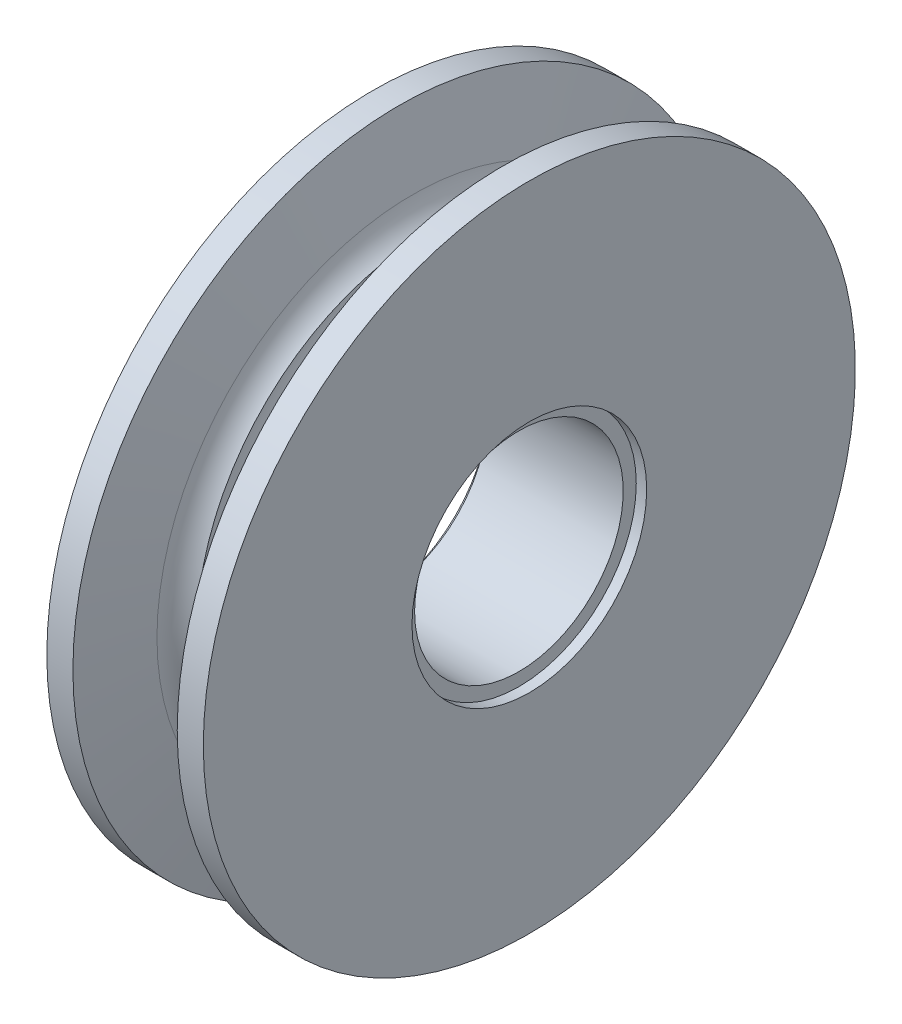
ISO-10303-21;
HEADER;
FILE_DESCRIPTION(('STEP AP214'),'2;1');
FILE_NAME('part.step','',(''),(''),'','','');
FILE_SCHEMA(('AUTOMOTIVE_DESIGN { 1 0 10303 214 1 1 1 1 }'));
ENDSEC;
DATA;
#1=APPLICATION_CONTEXT('core data for automotive mechanical design processes');
#2=APPLICATION_PROTOCOL_DEFINITION('international standard','automotive_design',2000,#1);
#3=PRODUCT_CONTEXT('',#1,'mechanical');
#4=PRODUCT('Part','Part','',(#3));
#5=PRODUCT_RELATED_PRODUCT_CATEGORY('part','',(#4));
#6=PRODUCT_DEFINITION_FORMATION('','',#4);
#7=PRODUCT_DEFINITION_CONTEXT('part definition',#1,'design');
#8=PRODUCT_DEFINITION('design','',#6,#7);
#9=PRODUCT_DEFINITION_SHAPE('','',#8);
#10=(LENGTH_UNIT() NAMED_UNIT(*) SI_UNIT(.MILLI.,.METRE.));
#11=(NAMED_UNIT(*) PLANE_ANGLE_UNIT() SI_UNIT($,.RADIAN.));
#12=(NAMED_UNIT(*) SI_UNIT($,.STERADIAN.) SOLID_ANGLE_UNIT());
#13=UNCERTAINTY_MEASURE_WITH_UNIT(LENGTH_MEASURE(1.E-05),#10,'distance_accuracy_value','');
#14=(GEOMETRIC_REPRESENTATION_CONTEXT(3) GLOBAL_UNCERTAINTY_ASSIGNED_CONTEXT((#13)) GLOBAL_UNIT_ASSIGNED_CONTEXT((#10,
#11,#12)) REPRESENTATION_CONTEXT('',''));
#15=CARTESIAN_POINT('',(0.,0.,0.));
#16=DIRECTION('',(0.,0.,1.));
#17=DIRECTION('',(1.,0.,0.));
#18=AXIS2_PLACEMENT_3D('',#15,#16,#17);
#19=CARTESIAN_POINT('',(6.,0.,0.));
#20=DIRECTION('',(-1.,0.,0.));
#21=DIRECTION('',(0.,0.,1.));
#22=AXIS2_PLACEMENT_3D('',#19,#20,#21);
#23=CYLINDRICAL_SURFACE('',#22,8.);
#24=CARTESIAN_POINT('',(-5.2,0.,0.));
#25=DIRECTION('',(-1.,0.,0.));
#26=DIRECTION('',(0.,0.,1.));
#27=AXIS2_PLACEMENT_3D('',#24,#25,#26);
#28=CIRCLE('',#27,8.);
#29=CARTESIAN_POINT('',(-5.2,0.,8.));
#30=VERTEX_POINT('',#29);
#31=EDGE_CURVE('E49',#30,#30,#28,.F.);
#32=CARTESIAN_POINT('',(5.2,0.,0.));
#33=DIRECTION('',(1.,0.,0.));
#34=DIRECTION('',(0.,0.,-1.));
#35=AXIS2_PLACEMENT_3D('',#32,#33,#34);
#36=CIRCLE('',#35,8.);
#37=CARTESIAN_POINT('',(5.2,0.,8.));
#38=VERTEX_POINT('',#37);
#39=EDGE_CURVE('E37',#38,#38,#36,.F.);
#40=CARTESIAN_POINT('',(-5.2,0.,8.));
#41=CARTESIAN_POINT('',(-5.09166666666666,0.,8.));
#42=CARTESIAN_POINT('',(-4.98333333333333,0.,8.));
#43=CARTESIAN_POINT('',(-4.76666666666666,0.,8.));
#44=CARTESIAN_POINT('',(-4.65833333333333,0.,8.));
#45=CARTESIAN_POINT('',(-4.44166666666666,0.,8.));
#46=CARTESIAN_POINT('',(-4.33333333333333,0.,8.));
#47=CARTESIAN_POINT('',(-4.11666666666667,0.,8.));
#48=CARTESIAN_POINT('',(-4.00833333333333,0.,8.));
#49=CARTESIAN_POINT('',(-3.79166666666667,0.,8.));
#50=CARTESIAN_POINT('',(-3.68333333333333,0.,8.));
#51=CARTESIAN_POINT('',(-3.46666666666666,0.,8.));
#52=CARTESIAN_POINT('',(-3.35833333333333,0.,8.));
#53=CARTESIAN_POINT('',(-3.14166666666666,0.,8.));
#54=CARTESIAN_POINT('',(-3.03333333333333,0.,8.));
#55=CARTESIAN_POINT('',(-2.81666666666667,0.,8.));
#56=CARTESIAN_POINT('',(-2.70833333333333,0.,8.));
#57=CARTESIAN_POINT('',(-2.49166666666666,0.,8.));
#58=CARTESIAN_POINT('',(-2.38333333333333,0.,8.));
#59=CARTESIAN_POINT('',(-2.16666666666666,0.,8.));
#60=CARTESIAN_POINT('',(-2.05833333333333,0.,8.));
#61=CARTESIAN_POINT('',(-1.84166666666667,0.,8.));
#62=CARTESIAN_POINT('',(-1.73333333333333,0.,8.));
#63=CARTESIAN_POINT('',(-1.51666666666667,0.,8.));
#64=CARTESIAN_POINT('',(-1.40833333333333,0.,8.));
#65=CARTESIAN_POINT('',(-1.19166666666667,0.,8.));
#66=CARTESIAN_POINT('',(-1.08333333333333,0.,8.));
#67=CARTESIAN_POINT('',(-0.866666666666666,0.,8.));
#68=CARTESIAN_POINT('',(-0.758333333333332,0.,8.));
#69=CARTESIAN_POINT('',(-0.541666666666665,0.,8.));
#70=CARTESIAN_POINT('',(-0.433333333333332,0.,8.));
#71=CARTESIAN_POINT('',(-0.216666666666666,0.,8.));
#72=CARTESIAN_POINT('',(-0.108333333333332,0.,8.));
#73=CARTESIAN_POINT('',(0.108333333333334,0.,8.));
#74=CARTESIAN_POINT('',(0.216666666666667,0.,8.));
#75=CARTESIAN_POINT('',(0.433333333333334,0.,8.));
#76=CARTESIAN_POINT('',(0.541666666666667,0.,8.));
#77=CARTESIAN_POINT('',(0.758333333333334,0.,8.));
#78=CARTESIAN_POINT('',(0.866666666666667,0.,8.));
#79=CARTESIAN_POINT('',(1.08333333333333,0.,8.));
#80=CARTESIAN_POINT('',(1.19166666666667,0.,8.));
#81=CARTESIAN_POINT('',(1.40833333333333,0.,8.));
#82=CARTESIAN_POINT('',(1.51666666666667,0.,8.));
#83=CARTESIAN_POINT('',(1.73333333333333,0.,8.));
#84=CARTESIAN_POINT('',(1.84166666666667,0.,8.));
#85=CARTESIAN_POINT('',(2.05833333333333,0.,8.));
#86=CARTESIAN_POINT('',(2.16666666666667,0.,8.));
#87=CARTESIAN_POINT('',(2.38333333333333,0.,8.));
#88=CARTESIAN_POINT('',(2.49166666666667,0.,8.));
#89=CARTESIAN_POINT('',(2.70833333333333,0.,8.));
#90=CARTESIAN_POINT('',(2.81666666666667,0.,8.));
#91=CARTESIAN_POINT('',(3.03333333333333,0.,8.));
#92=CARTESIAN_POINT('',(3.14166666666667,0.,8.));
#93=CARTESIAN_POINT('',(3.35833333333333,0.,8.));
#94=CARTESIAN_POINT('',(3.46666666666667,0.,8.));
#95=CARTESIAN_POINT('',(3.68333333333333,0.,8.));
#96=CARTESIAN_POINT('',(3.79166666666667,0.,8.));
#97=CARTESIAN_POINT('',(4.00833333333333,0.,8.));
#98=CARTESIAN_POINT('',(4.11666666666667,0.,8.));
#99=CARTESIAN_POINT('',(4.33333333333333,0.,8.));
#100=CARTESIAN_POINT('',(4.44166666666667,0.,8.));
#101=CARTESIAN_POINT('',(4.65833333333333,0.,8.));
#102=CARTESIAN_POINT('',(4.76666666666667,0.,8.));
#103=CARTESIAN_POINT('',(4.98333333333333,0.,8.));
#104=CARTESIAN_POINT('',(5.09166666666667,0.,8.));
#105=CARTESIAN_POINT('',(5.2,0.,8.));
#106=B_SPLINE_CURVE_WITH_KNOTS('',3,(#40,#41,#42,#43,#44,#45,#46,#47,#48,#49,#50,#51,#52,#53,
#54,#55,#56,#57,#58,#59,#60,#61,#62,#63,#64,#65,#66,#67,#68,#69,#70,#71,#72,#73,#74,#75,#76,#77,
#78,#79,#80,#81,#82,#83,#84,#85,#86,#87,#88,#89,#90,#91,#92,#93,#94,#95,#96,#97,#98,#99,#100,
#101,#102,#103,#104,#105),.UNSPECIFIED.,.F.,.F.,(4,2,2,2,2,2,2,2,2,2,2,2,2,2,2,2,2,2,2,2,2,2,2,
2,2,2,2,2,2,2,2,2,4),(0.,0.325000000000001,0.65,0.975,1.3,1.625,1.95,2.275,2.6,2.925,3.25,3.575,
3.9,4.225,4.55,4.875,5.2,5.525,5.85,6.175,6.5,6.825,7.15,7.475,7.8,8.125,8.45,8.775,9.1,9.425,
9.75,10.075,10.4),.UNSPECIFIED.);
#107=EDGE_CURVE('BSEAM33',#30,#38,#106,.T.);
#108=ORIENTED_EDGE('',*,*,#31,.F.);
#109=ORIENTED_EDGE('',*,*,#39,.F.);
#110=ORIENTED_EDGE('',*,*,#107,.T.);
#111=ORIENTED_EDGE('',*,*,#107,.F.);
#112=EDGE_LOOP('',(#108,#110,#109,#111));
#113=FACE_BOUND('',#112,.T.);
#114=ADVANCED_FACE('F33',(#113),#23,.F.);
#115=CARTESIAN_POINT('',(6.,0.,0.));
#116=DIRECTION('',(-1.,0.,0.));
#117=DIRECTION('',(0.,0.,1.));
#118=AXIS2_PLACEMENT_3D('',#115,#116,#117);
#119=PLANE('',#118);
#120=CARTESIAN_POINT('',(6.,0.,0.));
#121=DIRECTION('',(-1.,0.,0.));
#122=DIRECTION('',(0.,0.,1.));
#123=AXIS2_PLACEMENT_3D('',#120,#121,#122);
#124=CIRCLE('',#123,25.);
#125=CARTESIAN_POINT('',(6.,0.,25.));
#126=VERTEX_POINT('',#125);
#127=EDGE_CURVE('E77',#126,#126,#124,.T.);
#128=ORIENTED_EDGE('',*,*,#127,.F.);
#129=EDGE_LOOP('',(#128));
#130=FACE_BOUND('',#129,.T.);
#131=CARTESIAN_POINT('',(6.,0.,0.));
#132=DIRECTION('',(-1.,0.,0.));
#133=DIRECTION('',(0.,0.,1.));
#134=AXIS2_PLACEMENT_3D('',#131,#132,#133);
#135=CIRCLE('',#134,9.);
#136=CARTESIAN_POINT('',(6.,0.,9.));
#137=VERTEX_POINT('',#136);
#138=EDGE_CURVE('E66',#137,#137,#135,.T.);
#139=ORIENTED_EDGE('',*,*,#138,.T.);
#140=EDGE_LOOP('',(#139));
#141=FACE_BOUND('',#140,.T.);
#142=ADVANCED_FACE('F95',(#130,#141),#119,.F.);
#143=CARTESIAN_POINT('',(0.,0.,0.));
#144=DIRECTION('',(-1.,0.,0.));
#145=DIRECTION('',(0.,0.,1.));
#146=AXIS2_PLACEMENT_3D('',#143,#144,#145);
#147=TOROIDAL_SURFACE('',#146,20.1866985862023,3.);
#148=CARTESIAN_POINT('',(-2.94403514048012,0.,0.));
#149=DIRECTION('',(-1.,0.,0.));
#150=DIRECTION('',(0.,0.,1.));
#151=AXIS2_PLACEMENT_3D('',#148,#149,#150);
#152=CIRCLE('',#151,19.6099342568456);
#153=CARTESIAN_POINT('',(-2.94403514048012,0.,19.6099342568456));
#154=VERTEX_POINT('',#153);
#155=EDGE_CURVE('E10',#154,#154,#152,.T.);
#156=ORIENTED_EDGE('',*,*,#155,.F.);
#157=EDGE_LOOP('',(#156));
#158=FACE_BOUND('',#157,.T.);
#159=CARTESIAN_POINT('',(-1.75,0.,0.));
#160=DIRECTION('',(-1.,0.,0.));
#161=DIRECTION('',(0.,0.,1.));
#162=AXIS2_PLACEMENT_3D('',#159,#160,#161);
#163=CIRCLE('',#162,17.75);
#164=CARTESIAN_POINT('',(-1.75,0.,17.75));
#165=VERTEX_POINT('',#164);
#166=EDGE_CURVE('E51',#165,#165,#163,.T.);
#167=ORIENTED_EDGE('',*,*,#166,.T.);
#168=EDGE_LOOP('',(#167));
#169=FACE_BOUND('',#168,.T.);
#170=ADVANCED_FACE('F35',(#158,#169),#147,.F.);
#171=CARTESIAN_POINT('',(-2.94403514048012,0.,0.));
#172=DIRECTION('',(-1.,0.,0.));
#173=DIRECTION('',(0.,0.,1.));
#174=AXIS2_PLACEMENT_3D('',#171,#172,#173);
#175=CONICAL_SURFACE('',#174,19.6099342568456,1.3773370563324);
#176=CARTESIAN_POINT('',(-4.,0.,0.));
#177=DIRECTION('',(-1.,0.,0.));
#178=DIRECTION('',(0.,0.,1.));
#179=AXIS2_PLACEMENT_3D('',#176,#177,#178);
#180=CIRCLE('',#179,25.);
#181=CARTESIAN_POINT('',(-4.,0.,25.));
#182=VERTEX_POINT('',#181);
#183=EDGE_CURVE('E41',#182,#182,#180,.T.);
#184=ORIENTED_EDGE('',*,*,#183,.F.);
#185=EDGE_LOOP('',(#184));
#186=FACE_BOUND('',#185,.T.);
#187=ORIENTED_EDGE('',*,*,#155,.T.);
#188=EDGE_LOOP('',(#187));
#189=FACE_BOUND('',#188,.T.);
#190=ADVANCED_FACE('F87',(#186,#189),#175,.T.);
#191=CARTESIAN_POINT('',(-6.,0.,0.));
#192=DIRECTION('',(-1.,0.,0.));
#193=DIRECTION('',(0.,0.,1.));
#194=AXIS2_PLACEMENT_3D('',#191,#192,#193);
#195=CYLINDRICAL_SURFACE('',#194,25.);
#196=CARTESIAN_POINT('',(-6.,0.,0.));
#197=DIRECTION('',(-1.,0.,0.));
#198=DIRECTION('',(0.,0.,1.));
#199=AXIS2_PLACEMENT_3D('',#196,#197,#198);
#200=CIRCLE('',#199,25.);
#201=CARTESIAN_POINT('',(-6.,0.,25.));
#202=VERTEX_POINT('',#201);
#203=EDGE_CURVE('E46',#202,#202,#200,.T.);
#204=ORIENTED_EDGE('',*,*,#203,.F.);
#205=EDGE_LOOP('',(#204));
#206=FACE_BOUND('',#205,.T.);
#207=ORIENTED_EDGE('',*,*,#183,.T.);
#208=EDGE_LOOP('',(#207));
#209=FACE_BOUND('',#208,.T.);
#210=ADVANCED_FACE('F84',(#206,#209),#195,.T.);
#211=CARTESIAN_POINT('',(-6.,25.,0.));
#212=DIRECTION('',(1.,0.,0.));
#213=DIRECTION('',(0.,0.,-1.));
#214=AXIS2_PLACEMENT_3D('',#211,#212,#213);
#215=PLANE('',#214);
#216=CARTESIAN_POINT('',(-6.,0.,0.));
#217=DIRECTION('',(-1.,0.,0.));
#218=DIRECTION('',(0.,0.,1.));
#219=AXIS2_PLACEMENT_3D('',#216,#217,#218);
#220=CIRCLE('',#219,9.);
#221=CARTESIAN_POINT('',(-6.,0.,9.));
#222=VERTEX_POINT('',#221);
#223=EDGE_CURVE('E59',#222,#222,#220,.T.);
#224=ORIENTED_EDGE('',*,*,#223,.F.);
#225=EDGE_LOOP('',(#224));
#226=FACE_BOUND('',#225,.T.);
#227=ORIENTED_EDGE('',*,*,#203,.T.);
#228=EDGE_LOOP('',(#227));
#229=FACE_BOUND('',#228,.T.);
#230=ADVANCED_FACE('F82',(#226,#229),#215,.F.);
#231=CARTESIAN_POINT('',(-6.,0.,0.));
#232=DIRECTION('',(-1.,0.,0.));
#233=DIRECTION('',(0.,0.,1.));
#234=AXIS2_PLACEMENT_3D('',#231,#232,#233);
#235=CYLINDRICAL_SURFACE('',#234,25.);
#236=CARTESIAN_POINT('',(4.,0.,0.));
#237=DIRECTION('',(-1.,0.,0.));
#238=DIRECTION('',(0.,0.,1.));
#239=AXIS2_PLACEMENT_3D('',#236,#237,#238);
#240=CIRCLE('',#239,25.);
#241=CARTESIAN_POINT('',(4.,0.,25.));
#242=VERTEX_POINT('',#241);
#243=EDGE_CURVE('E74',#242,#242,#240,.T.);
#244=ORIENTED_EDGE('',*,*,#243,.F.);
#245=EDGE_LOOP('',(#244));
#246=FACE_BOUND('',#245,.T.);
#247=ORIENTED_EDGE('',*,*,#127,.T.);
#248=EDGE_LOOP('',(#247));
#249=FACE_BOUND('',#248,.T.);
#250=ADVANCED_FACE('F122',(#246,#249),#235,.T.);
#251=CARTESIAN_POINT('',(4.,0.,0.));
#252=DIRECTION('',(1.,0.,0.));
#253=DIRECTION('',(0.,0.,-1.));
#254=AXIS2_PLACEMENT_3D('',#251,#252,#253);
#255=CONICAL_SURFACE('',#254,25.,1.3773370563324);
#256=CARTESIAN_POINT('',(2.94403514048011,0.,0.));
#257=DIRECTION('',(-1.,0.,0.));
#258=DIRECTION('',(0.,0.,1.));
#259=AXIS2_PLACEMENT_3D('',#256,#257,#258);
#260=CIRCLE('',#259,19.6099342568456);
#261=CARTESIAN_POINT('',(2.94403514048011,0.,19.6099342568456));
#262=VERTEX_POINT('',#261);
#263=EDGE_CURVE('E71',#262,#262,#260,.T.);
#264=ORIENTED_EDGE('',*,*,#263,.F.);
#265=EDGE_LOOP('',(#264));
#266=FACE_BOUND('',#265,.T.);
#267=ORIENTED_EDGE('',*,*,#243,.T.);
#268=EDGE_LOOP('',(#267));
#269=FACE_BOUND('',#268,.T.);
#270=ADVANCED_FACE('F118',(#266,#269),#255,.T.);
#271=CARTESIAN_POINT('',(0.,0.,0.));
#272=DIRECTION('',(-1.,0.,0.));
#273=DIRECTION('',(0.,0.,1.));
#274=AXIS2_PLACEMENT_3D('',#271,#272,#273);
#275=TOROIDAL_SURFACE('',#274,20.1866985862023,3.);
#276=CARTESIAN_POINT('',(1.75,0.,0.));
#277=DIRECTION('',(-1.,0.,0.));
#278=DIRECTION('',(0.,0.,1.));
#279=AXIS2_PLACEMENT_3D('',#276,#277,#278);
#280=CIRCLE('',#279,17.75);
#281=CARTESIAN_POINT('',(1.75,0.,17.75));
#282=VERTEX_POINT('',#281);
#283=EDGE_CURVE('E56',#282,#282,#280,.T.);
#284=ORIENTED_EDGE('',*,*,#283,.F.);
#285=EDGE_LOOP('',(#284));
#286=FACE_BOUND('',#285,.T.);
#287=ORIENTED_EDGE('',*,*,#263,.T.);
#288=EDGE_LOOP('',(#287));
#289=FACE_BOUND('',#288,.T.);
#290=ADVANCED_FACE('F114',(#286,#289),#275,.F.);
#291=CARTESIAN_POINT('',(0.,0.,0.));
#292=DIRECTION('',(-1.,0.,0.));
#293=DIRECTION('',(0.,0.,1.));
#294=AXIS2_PLACEMENT_3D('',#291,#292,#293);
#295=TOROIDAL_SURFACE('',#294,17.75,1.75);
#296=ORIENTED_EDGE('',*,*,#166,.F.);
#297=EDGE_LOOP('',(#296));
#298=FACE_BOUND('',#297,.T.);
#299=ORIENTED_EDGE('',*,*,#283,.T.);
#300=EDGE_LOOP('',(#299));
#301=FACE_BOUND('',#300,.T.);
#302=ADVANCED_FACE('F110',(#298,#301),#295,.F.);
#303=CARTESIAN_POINT('',(-5.2,0.,0.));
#304=DIRECTION('',(-1.,0.,0.));
#305=DIRECTION('',(0.,0.,1.));
#306=AXIS2_PLACEMENT_3D('',#303,#304,#305);
#307=PLANE('',#306);
#308=CARTESIAN_POINT('',(-5.2,0.,0.));
#309=DIRECTION('',(-1.,0.,0.));
#310=DIRECTION('',(0.,0.,1.));
#311=AXIS2_PLACEMENT_3D('',#308,#309,#310);
#312=CIRCLE('',#311,9.);
#313=CARTESIAN_POINT('',(-5.2,0.,9.));
#314=VERTEX_POINT('',#313);
#315=EDGE_CURVE('E52',#314,#314,#312,.T.);
#316=ORIENTED_EDGE('',*,*,#315,.T.);
#317=EDGE_LOOP('',(#316));
#318=FACE_BOUND('',#317,.T.);
#319=ORIENTED_EDGE('',*,*,#31,.T.);
#320=EDGE_LOOP('',(#319));
#321=FACE_BOUND('',#320,.T.);
#322=ADVANCED_FACE('F113',(#318,#321),#307,.T.);
#323=CARTESIAN_POINT('',(-5.2,0.,0.));
#324=DIRECTION('',(-1.,0.,0.));
#325=DIRECTION('',(0.,0.,1.));
#326=AXIS2_PLACEMENT_3D('',#323,#324,#325);
#327=CYLINDRICAL_SURFACE('',#326,9.);
#328=ORIENTED_EDGE('',*,*,#315,.F.);
#329=EDGE_LOOP('',(#328));
#330=FACE_BOUND('',#329,.T.);
#331=ORIENTED_EDGE('',*,*,#223,.T.);
#332=EDGE_LOOP('',(#331));
#333=FACE_BOUND('',#332,.T.);
#334=ADVANCED_FACE('F108',(#330,#333),#327,.F.);
#335=CARTESIAN_POINT('',(5.2,0.,0.));
#336=DIRECTION('',(1.,0.,0.));
#337=DIRECTION('',(0.,0.,1.));
#338=AXIS2_PLACEMENT_3D('',#335,#336,#337);
#339=PLANE('',#338);
#340=CARTESIAN_POINT('',(5.2,0.,0.));
#341=DIRECTION('',(-1.,0.,0.));
#342=DIRECTION('',(0.,0.,1.));
#343=AXIS2_PLACEMENT_3D('',#340,#341,#342);
#344=CIRCLE('',#343,9.);
#345=CARTESIAN_POINT('',(5.2,0.,9.));
#346=VERTEX_POINT('',#345);
#347=EDGE_CURVE('E153',#346,#346,#344,.T.);
#348=ORIENTED_EDGE('',*,*,#347,.F.);
#349=EDGE_LOOP('',(#348));
#350=FACE_BOUND('',#349,.T.);
#351=ORIENTED_EDGE('',*,*,#39,.T.);
#352=EDGE_LOOP('',(#351));
#353=FACE_BOUND('',#352,.T.);
#354=ADVANCED_FACE('F134',(#350,#353),#339,.T.);
#355=CARTESIAN_POINT('',(5.2,0.,0.));
#356=DIRECTION('',(1.,0.,0.));
#357=DIRECTION('',(0.,0.,-1.));
#358=AXIS2_PLACEMENT_3D('',#355,#356,#357);
#359=CYLINDRICAL_SURFACE('',#358,9.);
#360=ORIENTED_EDGE('',*,*,#347,.T.);
#361=EDGE_LOOP('',(#360));
#362=FACE_BOUND('',#361,.T.);
#363=ORIENTED_EDGE('',*,*,#138,.F.);
#364=EDGE_LOOP('',(#363));
#365=FACE_BOUND('',#364,.T.);
#366=ADVANCED_FACE('F140',(#362,#365),#359,.F.);
#367=CLOSED_SHELL('',(#114,#142,#170,#190,#210,#230,#250,#270,#290,#302,#322,#334,#354,#366));
#368=MANIFOLD_SOLID_BREP('B2',#367);
#369=ADVANCED_BREP_SHAPE_REPRESENTATION('',(#18,#368),#14);
#370=SHAPE_DEFINITION_REPRESENTATION(#9,#369);
ENDSEC;
END-ISO-10303-21;
